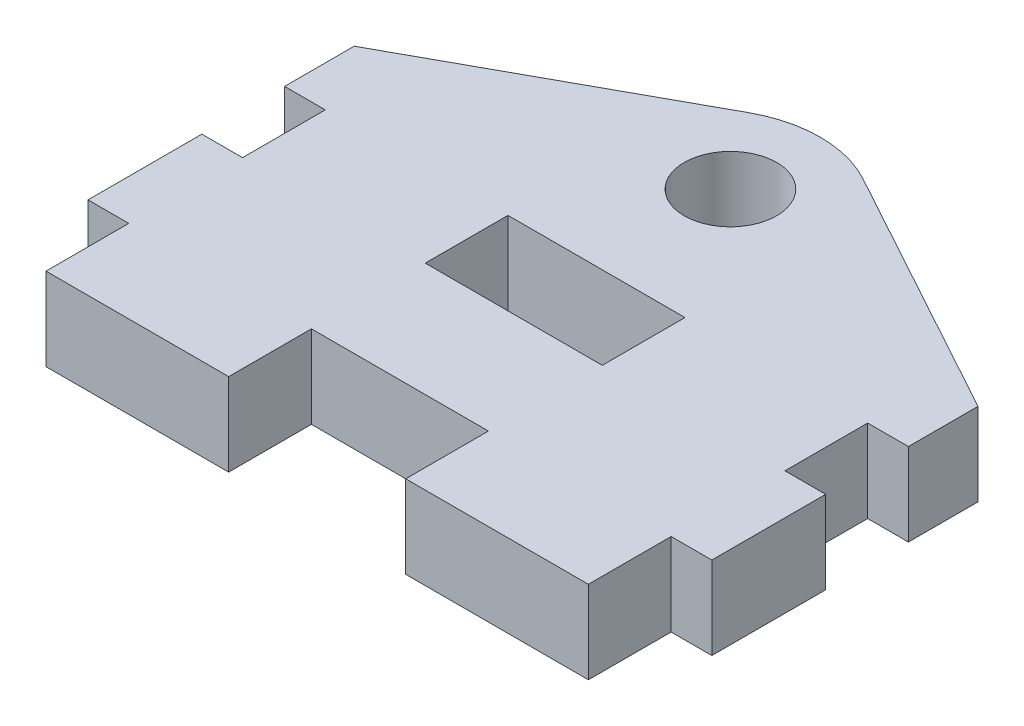
ISO-10303-21;
HEADER;
FILE_DESCRIPTION(('STEP AP214'),'2;1');
FILE_NAME('part.step','',(''),(''),'','','');
FILE_SCHEMA(('AUTOMOTIVE_DESIGN { 1 0 10303 214 1 1 1 1 }'));
ENDSEC;
DATA;
#1=APPLICATION_CONTEXT('core data for automotive mechanical design processes');
#2=APPLICATION_PROTOCOL_DEFINITION('international standard','automotive_design',2000,#1);
#3=PRODUCT_CONTEXT('',#1,'mechanical');
#4=PRODUCT('Part','Part','',(#3));
#5=PRODUCT_RELATED_PRODUCT_CATEGORY('part','',(#4));
#6=PRODUCT_DEFINITION_FORMATION('','',#4);
#7=PRODUCT_DEFINITION_CONTEXT('part definition',#1,'design');
#8=PRODUCT_DEFINITION('design','',#6,#7);
#9=PRODUCT_DEFINITION_SHAPE('','',#8);
#10=(LENGTH_UNIT() NAMED_UNIT(*) SI_UNIT(.MILLI.,.METRE.));
#11=(NAMED_UNIT(*) PLANE_ANGLE_UNIT() SI_UNIT($,.RADIAN.));
#12=(NAMED_UNIT(*) SI_UNIT($,.STERADIAN.) SOLID_ANGLE_UNIT());
#13=UNCERTAINTY_MEASURE_WITH_UNIT(LENGTH_MEASURE(1.E-05),#10,'distance_accuracy_value','');
#14=(GEOMETRIC_REPRESENTATION_CONTEXT(3) GLOBAL_UNCERTAINTY_ASSIGNED_CONTEXT((#13)) GLOBAL_UNIT_ASSIGNED_CONTEXT((#10,
#11,#12)) REPRESENTATION_CONTEXT('',''));
#15=CARTESIAN_POINT('',(0.,0.,0.));
#16=DIRECTION('',(0.,0.,1.));
#17=DIRECTION('',(1.,0.,0.));
#18=AXIS2_PLACEMENT_3D('',#15,#16,#17);
#19=CARTESIAN_POINT('',(-25.6,5.842,-21.2852032988051));
#20=DIRECTION('',(0.,-1.,0.));
#21=DIRECTION('',(0.,0.,-1.));
#22=AXIS2_PLACEMENT_3D('',#19,#20,#21);
#23=PLANE('',#22);
#24=CARTESIAN_POINT('',(-25.6,5.842,-23.3390276458498));
#25=DIRECTION('',(0.,1.,0.));
#26=DIRECTION('',(0.,0.,1.));
#27=AXIS2_PLACEMENT_3D('',#24,#25,#26);
#28=CIRCLE('',#27,3.26389999999999);
#29=CARTESIAN_POINT('',(-25.6,5.842,-20.0751276458499));
#30=VERTEX_POINT('',#29);
#31=EDGE_CURVE('E389',#30,#30,#28,.T.);
#32=ORIENTED_EDGE('',*,*,#31,.F.);
#33=EDGE_LOOP('',(#32));
#34=FACE_BOUND('',#33,.T.);
#35=DIRECTION('',(1.,0.,0.));
#36=VECTOR('',#35,1.);
#37=CARTESIAN_POINT('',(-0.400000000000005,5.842,-13.8795));
#38=LINE('',#37,#36);
#39=CARTESIAN_POINT('',(-6.45,5.842,-13.8795));
#40=VERTEX_POINT('',#39);
#41=CARTESIAN_POINT('',(-3.57499999999999,5.842,-13.8795));
#42=VERTEX_POINT('',#41);
#43=EDGE_CURVE('E221',#40,#42,#38,.T.);
#44=ORIENTED_EDGE('',*,*,#43,.T.);
#45=DIRECTION('',(0.,0.,1.));
#46=VECTOR('',#45,1.);
#47=CARTESIAN_POINT('',(-3.57499999999999,5.842,-13.7795));
#48=LINE('',#47,#46);
#49=CARTESIAN_POINT('',(-3.57499999999999,5.842,-18.7950088034694));
#50=VERTEX_POINT('',#49);
#51=EDGE_CURVE('E210',#50,#42,#48,.T.);
#52=ORIENTED_EDGE('',*,*,#51,.F.);
#53=DIRECTION('',(-0.876884617743927,0.,-0.480700912381168));
#54=VECTOR('',#53,1.);
#55=CARTESIAN_POINT('',(-0.400000000000005,5.842,-17.0545));
#56=LINE('',#55,#54);
#57=CARTESIAN_POINT('',(-21.5602739688845,5.842,-28.6543875989505));
#58=VERTEX_POINT('',#57);
#59=EDGE_CURVE('E218',#50,#58,#56,.T.);
#60=ORIENTED_EDGE('',*,*,#59,.T.);
#61=CARTESIAN_POINT('',(-25.6,5.842,-21.2852032988051));
#62=DIRECTION('',(0.,1.,0.));
#63=DIRECTION('',(0.,0.,-1.));
#64=AXIS2_PLACEMENT_3D('',#61,#62,#63);
#65=CIRCLE('',#64,8.40382434704476);
#66=CARTESIAN_POINT('',(-29.6397260311155,5.842,-28.6543875989505));
#67=VERTEX_POINT('',#66);
#68=EDGE_CURVE('E227',#58,#67,#65,.T.);
#69=ORIENTED_EDGE('',*,*,#68,.T.);
#70=DIRECTION('',(-0.876884617743927,0.,0.480700912381168));
#71=VECTOR('',#70,1.);
#72=CARTESIAN_POINT('',(-50.8,5.842,-17.0545));
#73=LINE('',#72,#71);
#74=CARTESIAN_POINT('',(-47.625,5.842,-18.7950088034694));
#75=VERTEX_POINT('',#74);
#76=EDGE_CURVE('E229',#67,#75,#73,.T.);
#77=ORIENTED_EDGE('',*,*,#76,.T.);
#78=DIRECTION('',(0.,0.,-1.));
#79=VECTOR('',#78,1.);
#80=CARTESIAN_POINT('',(-47.625,5.842,-13.8795));
#81=LINE('',#80,#79);
#82=CARTESIAN_POINT('',(-47.625,5.842,-13.8795));
#83=VERTEX_POINT('',#82);
#84=EDGE_CURVE('E359',#83,#75,#81,.T.);
#85=ORIENTED_EDGE('',*,*,#84,.F.);
#86=DIRECTION('',(1.,0.,0.));
#87=VECTOR('',#86,1.);
#88=CARTESIAN_POINT('',(-44.75,5.842,-13.8795));
#89=LINE('',#88,#87);
#90=CARTESIAN_POINT('',(-44.75,5.842,-13.8795));
#91=VERTEX_POINT('',#90);
#92=EDGE_CURVE('E237',#83,#91,#89,.T.);
#93=ORIENTED_EDGE('',*,*,#92,.T.);
#94=DIRECTION('',(0.,0.,1.));
#95=VECTOR('',#94,1.);
#96=CARTESIAN_POINT('',(-44.75,5.842,-8.03749999999998));
#97=LINE('',#96,#95);
#98=CARTESIAN_POINT('',(-44.75,5.842,-8.03749999999998));
#99=VERTEX_POINT('',#98);
#100=EDGE_CURVE('E239',#91,#99,#97,.T.);
#101=ORIENTED_EDGE('',*,*,#100,.T.);
#102=DIRECTION('',(-1.,0.,0.));
#103=VECTOR('',#102,1.);
#104=CARTESIAN_POINT('',(-44.75,5.842,-8.03749999999998));
#105=LINE('',#104,#103);
#106=CARTESIAN_POINT('',(-47.625,5.842,-8.03749999999999));
#107=VERTEX_POINT('',#106);
#108=EDGE_CURVE('E241',#99,#107,#105,.T.);
#109=ORIENTED_EDGE('',*,*,#108,.T.);
#110=DIRECTION('',(0.,0.,-1.));
#111=VECTOR('',#110,1.);
#112=CARTESIAN_POINT('',(-47.625,5.842,-8.03749999999999));
#113=LINE('',#112,#111);
#114=CARTESIAN_POINT('',(-47.625,5.842,0.));
#115=VERTEX_POINT('',#114);
#116=EDGE_CURVE('E380',#115,#107,#113,.T.);
#117=ORIENTED_EDGE('',*,*,#116,.F.);
#118=DIRECTION('',(1.,0.,0.));
#119=VECTOR('',#118,1.);
#120=CARTESIAN_POINT('',(-44.75,5.842,0.));
#121=LINE('',#120,#119);
#122=CARTESIAN_POINT('',(-44.75,5.842,0.));
#123=VERTEX_POINT('',#122);
#124=EDGE_CURVE('E244',#115,#123,#121,.T.);
#125=ORIENTED_EDGE('',*,*,#124,.T.);
#126=DIRECTION('',(0.,0.,1.));
#127=VECTOR('',#126,1.);
#128=CARTESIAN_POINT('',(-44.75,5.842,0.));
#129=LINE('',#128,#127);
#130=CARTESIAN_POINT('',(-44.75,5.842,5.842));
#131=VERTEX_POINT('',#130);
#132=EDGE_CURVE('E246',#123,#131,#129,.T.);
#133=ORIENTED_EDGE('',*,*,#132,.T.);
#134=DIRECTION('',(1.,0.,0.));
#135=VECTOR('',#134,1.);
#136=CARTESIAN_POINT('',(-44.75,5.842,5.842));
#137=LINE('',#136,#135);
#138=CARTESIAN_POINT('',(-31.85,5.842,5.842));
#139=VERTEX_POINT('',#138);
#140=EDGE_CURVE('E248',#131,#139,#137,.T.);
#141=ORIENTED_EDGE('',*,*,#140,.T.);
#142=DIRECTION('',(0.,0.,-1.));
#143=VECTOR('',#142,1.);
#144=CARTESIAN_POINT('',(-31.85,5.842,0.));
#145=LINE('',#144,#143);
#146=CARTESIAN_POINT('',(-31.85,5.842,0.));
#147=VERTEX_POINT('',#146);
#148=EDGE_CURVE('E250',#139,#147,#145,.T.);
#149=ORIENTED_EDGE('',*,*,#148,.T.);
#150=DIRECTION('',(1.,0.,0.));
#151=VECTOR('',#150,1.);
#152=CARTESIAN_POINT('',(-19.35,5.842,0.));
#153=LINE('',#152,#151);
#154=CARTESIAN_POINT('',(-19.35,5.842,0.));
#155=VERTEX_POINT('',#154);
#156=EDGE_CURVE('E252',#147,#155,#153,.T.);
#157=ORIENTED_EDGE('',*,*,#156,.T.);
#158=DIRECTION('',(0.,0.,1.));
#159=VECTOR('',#158,1.);
#160=CARTESIAN_POINT('',(-19.35,5.842,0.));
#161=LINE('',#160,#159);
#162=CARTESIAN_POINT('',(-19.35,5.842,5.842));
#163=VERTEX_POINT('',#162);
#164=EDGE_CURVE('E254',#155,#163,#161,.T.);
#165=ORIENTED_EDGE('',*,*,#164,.T.);
#166=DIRECTION('',(1.,0.,0.));
#167=VECTOR('',#166,1.);
#168=CARTESIAN_POINT('',(-6.45,5.842,5.842));
#169=LINE('',#168,#167);
#170=CARTESIAN_POINT('',(-6.45,5.842,5.842));
#171=VERTEX_POINT('',#170);
#172=EDGE_CURVE('E256',#163,#171,#169,.T.);
#173=ORIENTED_EDGE('',*,*,#172,.T.);
#174=DIRECTION('',(0.,0.,-1.));
#175=VECTOR('',#174,1.);
#176=CARTESIAN_POINT('',(-6.45,5.842,0.));
#177=LINE('',#176,#175);
#178=CARTESIAN_POINT('',(-6.45,5.842,0.));
#179=VERTEX_POINT('',#178);
#180=EDGE_CURVE('E258',#171,#179,#177,.T.);
#181=ORIENTED_EDGE('',*,*,#180,.T.);
#182=DIRECTION('',(1.,0.,0.));
#183=VECTOR('',#182,1.);
#184=CARTESIAN_POINT('',(0.,5.842,0.));
#185=LINE('',#184,#183);
#186=CARTESIAN_POINT('',(-3.57500000000001,5.842,0.));
#187=VERTEX_POINT('',#186);
#188=EDGE_CURVE('E260',#179,#187,#185,.T.);
#189=ORIENTED_EDGE('',*,*,#188,.T.);
#190=DIRECTION('',(0.,0.,1.));
#191=VECTOR('',#190,1.);
#192=CARTESIAN_POINT('',(-3.575,5.842,-9.49544559055014));
#193=LINE('',#192,#191);
#194=CARTESIAN_POINT('',(-3.575,5.842,-8.03749999999999));
#195=VERTEX_POINT('',#194);
#196=EDGE_CURVE('E370',#195,#187,#193,.T.);
#197=ORIENTED_EDGE('',*,*,#196,.F.);
#198=DIRECTION('',(-1.,0.,0.));
#199=VECTOR('',#198,1.);
#200=CARTESIAN_POINT('',(0.,5.842,-8.03749999999999));
#201=LINE('',#200,#199);
#202=CARTESIAN_POINT('',(-6.45,5.842,-8.03749999999999));
#203=VERTEX_POINT('',#202);
#204=EDGE_CURVE('E305',#195,#203,#201,.T.);
#205=ORIENTED_EDGE('',*,*,#204,.T.);
#206=DIRECTION('',(0.,0.,-1.));
#207=VECTOR('',#206,1.);
#208=CARTESIAN_POINT('',(-6.45,5.842,-8.03749999999999));
#209=LINE('',#208,#207);
#210=EDGE_CURVE('E231',#203,#40,#209,.T.);
#211=ORIENTED_EDGE('',*,*,#210,.T.);
#212=EDGE_LOOP('',(#44,#52,#60,#69,#77,#85,#93,#101,#109,#117,#125,#133,#141,#149,#157,#165,
#173,#181,#189,#197,#205,#211));
#213=FACE_BOUND('',#212,.T.);
#214=DIRECTION('',(0.,0.,-1.));
#215=VECTOR('',#214,1.);
#216=CARTESIAN_POINT('',(-19.35,5.842,-8.03749999999999));
#217=LINE('',#216,#215);
#218=CARTESIAN_POINT('',(-19.35,5.842,-8.03749999999999));
#219=VERTEX_POINT('',#218);
#220=CARTESIAN_POINT('',(-19.35,5.842,-13.8795));
#221=VERTEX_POINT('',#220);
#222=EDGE_CURVE('E397',#219,#221,#217,.T.);
#223=ORIENTED_EDGE('',*,*,#222,.F.);
#224=DIRECTION('',(1.,0.,0.));
#225=VECTOR('',#224,1.);
#226=CARTESIAN_POINT('',(-19.35,5.842,-8.03749999999999));
#227=LINE('',#226,#225);
#228=CARTESIAN_POINT('',(-31.85,5.842,-8.03749999999999));
#229=VERTEX_POINT('',#228);
#230=EDGE_CURVE('E405',#229,#219,#227,.T.);
#231=ORIENTED_EDGE('',*,*,#230,.F.);
#232=DIRECTION('',(0.,0.,1.));
#233=VECTOR('',#232,1.);
#234=CARTESIAN_POINT('',(-31.85,5.842,-8.03749999999999));
#235=LINE('',#234,#233);
#236=CARTESIAN_POINT('',(-31.85,5.842,-13.8795));
#237=VERTEX_POINT('',#236);
#238=EDGE_CURVE('E402',#237,#229,#235,.T.);
#239=ORIENTED_EDGE('',*,*,#238,.F.);
#240=DIRECTION('',(-1.,0.,0.));
#241=VECTOR('',#240,1.);
#242=CARTESIAN_POINT('',(-19.35,5.842,-13.8795));
#243=LINE('',#242,#241);
#244=EDGE_CURVE('E399',#221,#237,#243,.T.);
#245=ORIENTED_EDGE('',*,*,#244,.F.);
#246=EDGE_LOOP('',(#223,#231,#239,#245));
#247=FACE_BOUND('',#246,.T.);
#248=ADVANCED_FACE('F39',(#34,#213,#247),#23,.F.);
#249=CARTESIAN_POINT('',(-25.6,0.,-21.2852032988051));
#250=DIRECTION('',(0.,-1.,0.));
#251=DIRECTION('',(0.,0.,-1.));
#252=AXIS2_PLACEMENT_3D('',#249,#250,#251);
#253=PLANE('',#252);
#254=DIRECTION('',(0.,0.,1.));
#255=VECTOR('',#254,1.);
#256=CARTESIAN_POINT('',(-3.57499999999999,0.,-13.7795));
#257=LINE('',#256,#255);
#258=CARTESIAN_POINT('',(-3.575,0.,-18.7950088034694));
#259=VERTEX_POINT('',#258);
#260=CARTESIAN_POINT('',(-3.57499999999999,0.,-13.8795));
#261=VERTEX_POINT('',#260);
#262=EDGE_CURVE('E54',#259,#261,#257,.T.);
#263=ORIENTED_EDGE('',*,*,#262,.T.);
#264=DIRECTION('',(1.,0.,0.));
#265=VECTOR('',#264,1.);
#266=CARTESIAN_POINT('',(-0.400000000000005,0.,-13.8795));
#267=LINE('',#266,#265);
#268=CARTESIAN_POINT('',(-6.45,0.,-13.8795));
#269=VERTEX_POINT('',#268);
#270=EDGE_CURVE('E269',#269,#261,#267,.T.);
#271=ORIENTED_EDGE('',*,*,#270,.F.);
#272=DIRECTION('',(0.,0.,-1.));
#273=VECTOR('',#272,1.);
#274=CARTESIAN_POINT('',(-6.45,0.,-8.03749999999999));
#275=LINE('',#274,#273);
#276=CARTESIAN_POINT('',(-6.45,0.,-8.03749999999999));
#277=VERTEX_POINT('',#276);
#278=EDGE_CURVE('E266',#277,#269,#275,.T.);
#279=ORIENTED_EDGE('',*,*,#278,.F.);
#280=DIRECTION('',(-1.,0.,0.));
#281=VECTOR('',#280,1.);
#282=CARTESIAN_POINT('',(0.,0.,-8.03749999999999));
#283=LINE('',#282,#281);
#284=CARTESIAN_POINT('',(-3.575,0.,-8.03749999999999));
#285=VERTEX_POINT('',#284);
#286=EDGE_CURVE('E264',#285,#277,#283,.T.);
#287=ORIENTED_EDGE('',*,*,#286,.F.);
#288=DIRECTION('',(0.,0.,1.));
#289=VECTOR('',#288,1.);
#290=CARTESIAN_POINT('',(-3.575,0.,-9.49544559055014));
#291=LINE('',#290,#289);
#292=CARTESIAN_POINT('',(-3.57500000000001,0.,0.));
#293=VERTEX_POINT('',#292);
#294=EDGE_CURVE('E371',#285,#293,#291,.T.);
#295=ORIENTED_EDGE('',*,*,#294,.T.);
#296=DIRECTION('',(1.,0.,0.));
#297=VECTOR('',#296,1.);
#298=CARTESIAN_POINT('',(0.,0.,0.));
#299=LINE('',#298,#297);
#300=CARTESIAN_POINT('',(-6.45,0.,0.));
#301=VERTEX_POINT('',#300);
#302=EDGE_CURVE('E302',#301,#293,#299,.T.);
#303=ORIENTED_EDGE('',*,*,#302,.F.);
#304=DIRECTION('',(0.,0.,-1.));
#305=VECTOR('',#304,1.);
#306=CARTESIAN_POINT('',(-6.45,0.,0.));
#307=LINE('',#306,#305);
#308=CARTESIAN_POINT('',(-6.45,0.,5.842));
#309=VERTEX_POINT('',#308);
#310=EDGE_CURVE('E300',#309,#301,#307,.T.);
#311=ORIENTED_EDGE('',*,*,#310,.F.);
#312=DIRECTION('',(1.,0.,0.));
#313=VECTOR('',#312,1.);
#314=CARTESIAN_POINT('',(-6.45,0.,5.842));
#315=LINE('',#314,#313);
#316=CARTESIAN_POINT('',(-19.35,0.,5.842));
#317=VERTEX_POINT('',#316);
#318=EDGE_CURVE('E298',#317,#309,#315,.T.);
#319=ORIENTED_EDGE('',*,*,#318,.F.);
#320=DIRECTION('',(0.,0.,1.));
#321=VECTOR('',#320,1.);
#322=CARTESIAN_POINT('',(-19.35,0.,0.));
#323=LINE('',#322,#321);
#324=CARTESIAN_POINT('',(-19.35,0.,0.));
#325=VERTEX_POINT('',#324);
#326=EDGE_CURVE('E296',#325,#317,#323,.T.);
#327=ORIENTED_EDGE('',*,*,#326,.F.);
#328=DIRECTION('',(1.,0.,0.));
#329=VECTOR('',#328,1.);
#330=CARTESIAN_POINT('',(-19.35,0.,0.));
#331=LINE('',#330,#329);
#332=CARTESIAN_POINT('',(-31.85,0.,0.));
#333=VERTEX_POINT('',#332);
#334=EDGE_CURVE('E294',#333,#325,#331,.T.);
#335=ORIENTED_EDGE('',*,*,#334,.F.);
#336=DIRECTION('',(0.,0.,-1.));
#337=VECTOR('',#336,1.);
#338=CARTESIAN_POINT('',(-31.85,0.,0.));
#339=LINE('',#338,#337);
#340=CARTESIAN_POINT('',(-31.85,0.,5.842));
#341=VERTEX_POINT('',#340);
#342=EDGE_CURVE('E292',#341,#333,#339,.T.);
#343=ORIENTED_EDGE('',*,*,#342,.F.);
#344=DIRECTION('',(1.,0.,0.));
#345=VECTOR('',#344,1.);
#346=CARTESIAN_POINT('',(-44.75,0.,5.842));
#347=LINE('',#346,#345);
#348=CARTESIAN_POINT('',(-44.75,0.,5.842));
#349=VERTEX_POINT('',#348);
#350=EDGE_CURVE('E290',#349,#341,#347,.T.);
#351=ORIENTED_EDGE('',*,*,#350,.F.);
#352=DIRECTION('',(0.,0.,1.));
#353=VECTOR('',#352,1.);
#354=CARTESIAN_POINT('',(-44.75,0.,0.));
#355=LINE('',#354,#353);
#356=CARTESIAN_POINT('',(-44.75,0.,0.));
#357=VERTEX_POINT('',#356);
#358=EDGE_CURVE('E288',#357,#349,#355,.T.);
#359=ORIENTED_EDGE('',*,*,#358,.F.);
#360=DIRECTION('',(1.,0.,0.));
#361=VECTOR('',#360,1.);
#362=CARTESIAN_POINT('',(-44.75,0.,0.));
#363=LINE('',#362,#361);
#364=CARTESIAN_POINT('',(-47.625,0.,0.));
#365=VERTEX_POINT('',#364);
#366=EDGE_CURVE('E286',#365,#357,#363,.T.);
#367=ORIENTED_EDGE('',*,*,#366,.F.);
#368=DIRECTION('',(0.,0.,-1.));
#369=VECTOR('',#368,1.);
#370=CARTESIAN_POINT('',(-47.625,0.,-8.03749999999999));
#371=LINE('',#370,#369);
#372=CARTESIAN_POINT('',(-47.625,0.,-8.03749999999999));
#373=VERTEX_POINT('',#372);
#374=EDGE_CURVE('E381',#365,#373,#371,.T.);
#375=ORIENTED_EDGE('',*,*,#374,.T.);
#376=DIRECTION('',(-1.,0.,0.));
#377=VECTOR('',#376,1.);
#378=CARTESIAN_POINT('',(-44.75,0.,-8.03749999999998));
#379=LINE('',#378,#377);
#380=CARTESIAN_POINT('',(-44.75,0.,-8.03749999999998));
#381=VERTEX_POINT('',#380);
#382=EDGE_CURVE('E283',#381,#373,#379,.T.);
#383=ORIENTED_EDGE('',*,*,#382,.F.);
#384=DIRECTION('',(0.,0.,1.));
#385=VECTOR('',#384,1.);
#386=CARTESIAN_POINT('',(-44.75,0.,-8.03749999999998));
#387=LINE('',#386,#385);
#388=CARTESIAN_POINT('',(-44.75,0.,-13.8795));
#389=VERTEX_POINT('',#388);
#390=EDGE_CURVE('E281',#389,#381,#387,.T.);
#391=ORIENTED_EDGE('',*,*,#390,.F.);
#392=DIRECTION('',(1.,0.,0.));
#393=VECTOR('',#392,1.);
#394=CARTESIAN_POINT('',(-44.75,0.,-13.8795));
#395=LINE('',#394,#393);
#396=CARTESIAN_POINT('',(-47.625,0.,-13.8795));
#397=VERTEX_POINT('',#396);
#398=EDGE_CURVE('E279',#397,#389,#395,.T.);
#399=ORIENTED_EDGE('',*,*,#398,.F.);
#400=DIRECTION('',(0.,0.,-1.));
#401=VECTOR('',#400,1.);
#402=CARTESIAN_POINT('',(-47.625,0.,-13.8795));
#403=LINE('',#402,#401);
#404=CARTESIAN_POINT('',(-47.625,0.,-18.7950088034694));
#405=VERTEX_POINT('',#404);
#406=EDGE_CURVE('E61',#397,#405,#403,.T.);
#407=ORIENTED_EDGE('',*,*,#406,.T.);
#408=DIRECTION('',(-0.876884617743927,0.,0.480700912381168));
#409=VECTOR('',#408,1.);
#410=CARTESIAN_POINT('',(-50.8,0.,-17.0545));
#411=LINE('',#410,#409);
#412=CARTESIAN_POINT('',(-29.6397260311155,0.,-28.6543875989505));
#413=VERTEX_POINT('',#412);
#414=EDGE_CURVE('E276',#413,#405,#411,.T.);
#415=ORIENTED_EDGE('',*,*,#414,.F.);
#416=CARTESIAN_POINT('',(-25.6,0.,-21.2852032988051));
#417=DIRECTION('',(0.,1.,0.));
#418=DIRECTION('',(0.,0.,-1.));
#419=AXIS2_PLACEMENT_3D('',#416,#417,#418);
#420=CIRCLE('',#419,8.40382434704476);
#421=CARTESIAN_POINT('',(-21.5602739688845,0.,-28.6543875989505));
#422=VERTEX_POINT('',#421);
#423=EDGE_CURVE('E274',#422,#413,#420,.T.);
#424=ORIENTED_EDGE('',*,*,#423,.F.);
#425=DIRECTION('',(-0.876884617743927,0.,-0.480700912381168));
#426=VECTOR('',#425,1.);
#427=CARTESIAN_POINT('',(-0.400000000000005,0.,-17.0545));
#428=LINE('',#427,#426);
#429=EDGE_CURVE('E272',#259,#422,#428,.T.);
#430=ORIENTED_EDGE('',*,*,#429,.F.);
#431=EDGE_LOOP('',(#263,#271,#279,#287,#295,#303,#311,#319,#327,#335,#343,#351,#359,#367,#375,
#383,#391,#399,#407,#415,#424,#430));
#432=FACE_BOUND('',#431,.T.);
#433=CARTESIAN_POINT('',(-25.6,0.,-23.3390276458498));
#434=DIRECTION('',(0.,1.,0.));
#435=DIRECTION('',(0.,0.,1.));
#436=AXIS2_PLACEMENT_3D('',#433,#434,#435);
#437=CIRCLE('',#436,3.2639);
#438=CARTESIAN_POINT('',(-25.6,0.,-20.0751276458498));
#439=VERTEX_POINT('',#438);
#440=EDGE_CURVE('E393',#439,#439,#437,.T.);
#441=ORIENTED_EDGE('',*,*,#440,.T.);
#442=EDGE_LOOP('',(#441));
#443=FACE_BOUND('',#442,.T.);
#444=DIRECTION('',(1.,0.,0.));
#445=VECTOR('',#444,1.);
#446=CARTESIAN_POINT('',(-19.35,0.,-8.03749999999999));
#447=LINE('',#446,#445);
#448=CARTESIAN_POINT('',(-31.85,0.,-8.03749999999999));
#449=VERTEX_POINT('',#448);
#450=CARTESIAN_POINT('',(-19.35,0.,-8.03749999999999));
#451=VERTEX_POINT('',#450);
#452=EDGE_CURVE('E400',#449,#451,#447,.T.);
#453=ORIENTED_EDGE('',*,*,#452,.T.);
#454=DIRECTION('',(0.,0.,-1.));
#455=VECTOR('',#454,1.);
#456=CARTESIAN_POINT('',(-19.35,0.,-8.03749999999999));
#457=LINE('',#456,#455);
#458=CARTESIAN_POINT('',(-19.35,0.,-13.8795));
#459=VERTEX_POINT('',#458);
#460=EDGE_CURVE('E396',#451,#459,#457,.T.);
#461=ORIENTED_EDGE('',*,*,#460,.T.);
#462=DIRECTION('',(-1.,0.,0.));
#463=VECTOR('',#462,1.);
#464=CARTESIAN_POINT('',(-19.35,0.,-13.8795));
#465=LINE('',#464,#463);
#466=CARTESIAN_POINT('',(-31.85,0.,-13.8795));
#467=VERTEX_POINT('',#466);
#468=EDGE_CURVE('E410',#459,#467,#465,.T.);
#469=ORIENTED_EDGE('',*,*,#468,.T.);
#470=DIRECTION('',(0.,0.,1.));
#471=VECTOR('',#470,1.);
#472=CARTESIAN_POINT('',(-31.85,0.,-8.03749999999999));
#473=LINE('',#472,#471);
#474=EDGE_CURVE('E413',#467,#449,#473,.T.);
#475=ORIENTED_EDGE('',*,*,#474,.T.);
#476=EDGE_LOOP('',(#453,#461,#469,#475));
#477=FACE_BOUND('',#476,.T.);
#478=ADVANCED_FACE('F353',(#432,#443,#477),#253,.T.);
#479=CARTESIAN_POINT('',(0.,5.842,-8.03749999999999));
#480=DIRECTION('',(0.,0.,1.));
#481=DIRECTION('',(1.,0.,0.));
#482=AXIS2_PLACEMENT_3D('',#479,#480,#481);
#483=PLANE('',#482);
#484=ORIENTED_EDGE('',*,*,#204,.F.);
#485=DIRECTION('',(0.,-1.,0.));
#486=VECTOR('',#485,1.);
#487=CARTESIAN_POINT('',(-3.575,5.842,-8.03749999999999));
#488=LINE('',#487,#486);
#489=EDGE_CURVE('E377',#195,#285,#488,.T.);
#490=ORIENTED_EDGE('',*,*,#489,.T.);
#491=ORIENTED_EDGE('',*,*,#286,.T.);
#492=DIRECTION('',(0.,-1.,0.));
#493=VECTOR('',#492,1.);
#494=CARTESIAN_POINT('',(-6.45,5.842,-8.03749999999999));
#495=LINE('',#494,#493);
#496=EDGE_CURVE('E47',#203,#277,#495,.T.);
#497=ORIENTED_EDGE('',*,*,#496,.F.);
#498=EDGE_LOOP('',(#484,#490,#491,#497));
#499=FACE_BOUND('',#498,.T.);
#500=ADVANCED_FACE('F41',(#499),#483,.F.);
#501=CARTESIAN_POINT('',(-6.45,5.842,-8.03749999999999));
#502=DIRECTION('',(-1.,0.,0.));
#503=DIRECTION('',(0.,0.,1.));
#504=AXIS2_PLACEMENT_3D('',#501,#502,#503);
#505=PLANE('',#504);
#506=ORIENTED_EDGE('',*,*,#278,.T.);
#507=DIRECTION('',(0.,-1.,0.));
#508=VECTOR('',#507,1.);
#509=CARTESIAN_POINT('',(-6.45,5.842,-13.8795));
#510=LINE('',#509,#508);
#511=EDGE_CURVE('E339',#40,#269,#510,.T.);
#512=ORIENTED_EDGE('',*,*,#511,.F.);
#513=ORIENTED_EDGE('',*,*,#210,.F.);
#514=ORIENTED_EDGE('',*,*,#496,.T.);
#515=EDGE_LOOP('',(#506,#512,#513,#514));
#516=FACE_BOUND('',#515,.T.);
#517=ADVANCED_FACE('F346',(#516),#505,.F.);
#518=CARTESIAN_POINT('',(-0.400000000000005,5.842,-13.8795));
#519=DIRECTION('',(0.,0.,-1.));
#520=DIRECTION('',(-1.,0.,0.));
#521=AXIS2_PLACEMENT_3D('',#518,#519,#520);
#522=PLANE('',#521);
#523=ORIENTED_EDGE('',*,*,#270,.T.);
#524=DIRECTION('',(0.,1.,0.));
#525=VECTOR('',#524,1.);
#526=CARTESIAN_POINT('',(-3.57499999999999,5.842,-13.8795));
#527=LINE('',#526,#525);
#528=EDGE_CURVE('E358',#261,#42,#527,.T.);
#529=ORIENTED_EDGE('',*,*,#528,.T.);
#530=ORIENTED_EDGE('',*,*,#43,.F.);
#531=ORIENTED_EDGE('',*,*,#511,.T.);
#532=EDGE_LOOP('',(#523,#529,#530,#531));
#533=FACE_BOUND('',#532,.T.);
#534=ADVANCED_FACE('F357',(#533),#522,.F.);
#535=CARTESIAN_POINT('',(-0.400000000000005,5.842,-17.0545));
#536=DIRECTION('',(-0.480700912381168,0.,0.876884617743927));
#537=DIRECTION('',(0.876884617743927,0.,0.480700912381168));
#538=AXIS2_PLACEMENT_3D('',#535,#536,#537);
#539=PLANE('',#538);
#540=ORIENTED_EDGE('',*,*,#59,.F.);
#541=DIRECTION('',(0.,-1.,0.));
#542=VECTOR('',#541,1.);
#543=CARTESIAN_POINT('',(-3.57499999999999,5.842,-18.7950088034694));
#544=LINE('',#543,#542);
#545=EDGE_CURVE('E11',#50,#259,#544,.T.);
#546=ORIENTED_EDGE('',*,*,#545,.T.);
#547=ORIENTED_EDGE('',*,*,#429,.T.);
#548=DIRECTION('',(0.,-1.,0.));
#549=VECTOR('',#548,1.);
#550=CARTESIAN_POINT('',(-21.5602739688845,5.842,-28.6543875989505));
#551=LINE('',#550,#549);
#552=EDGE_CURVE('E225',#58,#422,#551,.T.);
#553=ORIENTED_EDGE('',*,*,#552,.F.);
#554=EDGE_LOOP('',(#540,#546,#547,#553));
#555=FACE_BOUND('',#554,.T.);
#556=ADVANCED_FACE('F223',(#555),#539,.F.);
#557=CARTESIAN_POINT('',(-25.6,5.842,-21.2852032988051));
#558=DIRECTION('',(0.,-1.,0.));
#559=DIRECTION('',(0.,0.,-1.));
#560=AXIS2_PLACEMENT_3D('',#557,#558,#559);
#561=CYLINDRICAL_SURFACE('',#560,8.40382434704476);
#562=ORIENTED_EDGE('',*,*,#423,.T.);
#563=DIRECTION('',(0.,-1.,0.));
#564=VECTOR('',#563,1.);
#565=CARTESIAN_POINT('',(-29.6397260311155,5.842,-28.6543875989505));
#566=LINE('',#565,#564);
#567=EDGE_CURVE('E335',#67,#413,#566,.T.);
#568=ORIENTED_EDGE('',*,*,#567,.F.);
#569=ORIENTED_EDGE('',*,*,#68,.F.);
#570=ORIENTED_EDGE('',*,*,#552,.T.);
#571=EDGE_LOOP('',(#562,#568,#569,#570));
#572=FACE_BOUND('',#571,.T.);
#573=ADVANCED_FACE('F500',(#572),#561,.T.);
#574=CARTESIAN_POINT('',(-50.8,5.842,-17.0545));
#575=DIRECTION('',(0.480700912381168,0.,0.876884617743927));
#576=DIRECTION('',(0.876884617743927,0.,-0.480700912381168));
#577=AXIS2_PLACEMENT_3D('',#574,#575,#576);
#578=PLANE('',#577);
#579=ORIENTED_EDGE('',*,*,#414,.T.);
#580=DIRECTION('',(0.,1.,0.));
#581=VECTOR('',#580,1.);
#582=CARTESIAN_POINT('',(-47.625,5.842,-18.7950088034694));
#583=LINE('',#582,#581);
#584=EDGE_CURVE('E367',#405,#75,#583,.T.);
#585=ORIENTED_EDGE('',*,*,#584,.T.);
#586=ORIENTED_EDGE('',*,*,#76,.F.);
#587=ORIENTED_EDGE('',*,*,#567,.T.);
#588=EDGE_LOOP('',(#579,#585,#586,#587));
#589=FACE_BOUND('',#588,.T.);
#590=ADVANCED_FACE('F496',(#589),#578,.F.);
#591=CARTESIAN_POINT('',(-44.75,5.842,-13.8795));
#592=DIRECTION('',(0.,0.,-1.));
#593=DIRECTION('',(-1.,0.,0.));
#594=AXIS2_PLACEMENT_3D('',#591,#592,#593);
#595=PLANE('',#594);
#596=ORIENTED_EDGE('',*,*,#92,.F.);
#597=DIRECTION('',(0.,1.,0.));
#598=VECTOR('',#597,1.);
#599=CARTESIAN_POINT('',(-47.625,0.,-13.8795));
#600=LINE('',#599,#598);
#601=EDGE_CURVE('E364',#397,#83,#600,.T.);
#602=ORIENTED_EDGE('',*,*,#601,.F.);
#603=ORIENTED_EDGE('',*,*,#398,.T.);
#604=DIRECTION('',(0.,-1.,0.));
#605=VECTOR('',#604,1.);
#606=CARTESIAN_POINT('',(-44.75,5.842,-13.8795));
#607=LINE('',#606,#605);
#608=EDGE_CURVE('E332',#91,#389,#607,.T.);
#609=ORIENTED_EDGE('',*,*,#608,.F.);
#610=EDGE_LOOP('',(#596,#602,#603,#609));
#611=FACE_BOUND('',#610,.T.);
#612=ADVANCED_FACE('F490',(#611),#595,.F.);
#613=CARTESIAN_POINT('',(-44.75,5.842,-8.03749999999998));
#614=DIRECTION('',(1.,0.,0.));
#615=DIRECTION('',(0.,0.,-1.));
#616=AXIS2_PLACEMENT_3D('',#613,#614,#615);
#617=PLANE('',#616);
#618=ORIENTED_EDGE('',*,*,#390,.T.);
#619=DIRECTION('',(0.,-1.,0.));
#620=VECTOR('',#619,1.);
#621=CARTESIAN_POINT('',(-44.75,5.842,-8.03749999999998));
#622=LINE('',#621,#620);
#623=EDGE_CURVE('E329',#99,#381,#622,.T.);
#624=ORIENTED_EDGE('',*,*,#623,.F.);
#625=ORIENTED_EDGE('',*,*,#100,.F.);
#626=ORIENTED_EDGE('',*,*,#608,.T.);
#627=EDGE_LOOP('',(#618,#624,#625,#626));
#628=FACE_BOUND('',#627,.T.);
#629=ADVANCED_FACE('F486',(#628),#617,.F.);
#630=CARTESIAN_POINT('',(-44.75,5.842,-8.03749999999998));
#631=DIRECTION('',(0.,0.,1.));
#632=DIRECTION('',(1.,0.,0.));
#633=AXIS2_PLACEMENT_3D('',#630,#631,#632);
#634=PLANE('',#633);
#635=ORIENTED_EDGE('',*,*,#382,.T.);
#636=DIRECTION('',(0.,1.,0.));
#637=VECTOR('',#636,1.);
#638=CARTESIAN_POINT('',(-47.625,0.,-8.03749999999999));
#639=LINE('',#638,#637);
#640=EDGE_CURVE('E386',#373,#107,#639,.T.);
#641=ORIENTED_EDGE('',*,*,#640,.T.);
#642=ORIENTED_EDGE('',*,*,#108,.F.);
#643=ORIENTED_EDGE('',*,*,#623,.T.);
#644=EDGE_LOOP('',(#635,#641,#642,#643));
#645=FACE_BOUND('',#644,.T.);
#646=ADVANCED_FACE('F482',(#645),#634,.F.);
#647=CARTESIAN_POINT('',(-44.75,5.842,0.));
#648=DIRECTION('',(0.,0.,-1.));
#649=DIRECTION('',(-1.,0.,0.));
#650=AXIS2_PLACEMENT_3D('',#647,#648,#649);
#651=PLANE('',#650);
#652=ORIENTED_EDGE('',*,*,#124,.F.);
#653=DIRECTION('',(0.,1.,0.));
#654=VECTOR('',#653,1.);
#655=CARTESIAN_POINT('',(-47.625,0.,0.));
#656=LINE('',#655,#654);
#657=EDGE_CURVE('E384',#365,#115,#656,.T.);
#658=ORIENTED_EDGE('',*,*,#657,.F.);
#659=ORIENTED_EDGE('',*,*,#366,.T.);
#660=DIRECTION('',(0.,-1.,0.));
#661=VECTOR('',#660,1.);
#662=CARTESIAN_POINT('',(-44.75,5.842,0.));
#663=LINE('',#662,#661);
#664=EDGE_CURVE('E326',#123,#357,#663,.T.);
#665=ORIENTED_EDGE('',*,*,#664,.F.);
#666=EDGE_LOOP('',(#652,#658,#659,#665));
#667=FACE_BOUND('',#666,.T.);
#668=ADVANCED_FACE('F474',(#667),#651,.F.);
#669=CARTESIAN_POINT('',(-44.75,5.842,0.));
#670=DIRECTION('',(1.,0.,0.));
#671=DIRECTION('',(0.,0.,-1.));
#672=AXIS2_PLACEMENT_3D('',#669,#670,#671);
#673=PLANE('',#672);
#674=ORIENTED_EDGE('',*,*,#358,.T.);
#675=DIRECTION('',(0.,-1.,0.));
#676=VECTOR('',#675,1.);
#677=CARTESIAN_POINT('',(-44.75,5.842,5.842));
#678=LINE('',#677,#676);
#679=EDGE_CURVE('E323',#131,#349,#678,.T.);
#680=ORIENTED_EDGE('',*,*,#679,.F.);
#681=ORIENTED_EDGE('',*,*,#132,.F.);
#682=ORIENTED_EDGE('',*,*,#664,.T.);
#683=EDGE_LOOP('',(#674,#680,#681,#682));
#684=FACE_BOUND('',#683,.T.);
#685=ADVANCED_FACE('F467',(#684),#673,.F.);
#686=CARTESIAN_POINT('',(-44.75,5.842,5.842));
#687=DIRECTION('',(0.,0.,-1.));
#688=DIRECTION('',(-1.,0.,0.));
#689=AXIS2_PLACEMENT_3D('',#686,#687,#688);
#690=PLANE('',#689);
#691=ORIENTED_EDGE('',*,*,#350,.T.);
#692=DIRECTION('',(0.,-1.,0.));
#693=VECTOR('',#692,1.);
#694=CARTESIAN_POINT('',(-31.85,5.842,5.842));
#695=LINE('',#694,#693);
#696=EDGE_CURVE('E320',#139,#341,#695,.T.);
#697=ORIENTED_EDGE('',*,*,#696,.F.);
#698=ORIENTED_EDGE('',*,*,#140,.F.);
#699=ORIENTED_EDGE('',*,*,#679,.T.);
#700=EDGE_LOOP('',(#691,#697,#698,#699));
#701=FACE_BOUND('',#700,.T.);
#702=ADVANCED_FACE('F463',(#701),#690,.F.);
#703=CARTESIAN_POINT('',(-31.85,5.842,0.));
#704=DIRECTION('',(-1.,0.,0.));
#705=DIRECTION('',(0.,0.,1.));
#706=AXIS2_PLACEMENT_3D('',#703,#704,#705);
#707=PLANE('',#706);
#708=ORIENTED_EDGE('',*,*,#342,.T.);
#709=DIRECTION('',(0.,-1.,0.));
#710=VECTOR('',#709,1.);
#711=CARTESIAN_POINT('',(-31.85,5.842,0.));
#712=LINE('',#711,#710);
#713=EDGE_CURVE('E317',#147,#333,#712,.T.);
#714=ORIENTED_EDGE('',*,*,#713,.F.);
#715=ORIENTED_EDGE('',*,*,#148,.F.);
#716=ORIENTED_EDGE('',*,*,#696,.T.);
#717=EDGE_LOOP('',(#708,#714,#715,#716));
#718=FACE_BOUND('',#717,.T.);
#719=ADVANCED_FACE('F458',(#718),#707,.F.);
#720=CARTESIAN_POINT('',(-19.35,5.842,0.));
#721=DIRECTION('',(0.,0.,-1.));
#722=DIRECTION('',(-1.,0.,0.));
#723=AXIS2_PLACEMENT_3D('',#720,#721,#722);
#724=PLANE('',#723);
#725=ORIENTED_EDGE('',*,*,#334,.T.);
#726=DIRECTION('',(0.,-1.,0.));
#727=VECTOR('',#726,1.);
#728=CARTESIAN_POINT('',(-19.35,5.842,0.));
#729=LINE('',#728,#727);
#730=EDGE_CURVE('E314',#155,#325,#729,.T.);
#731=ORIENTED_EDGE('',*,*,#730,.F.);
#732=ORIENTED_EDGE('',*,*,#156,.F.);
#733=ORIENTED_EDGE('',*,*,#713,.T.);
#734=EDGE_LOOP('',(#725,#731,#732,#733));
#735=FACE_BOUND('',#734,.T.);
#736=ADVANCED_FACE('F452',(#735),#724,.F.);
#737=CARTESIAN_POINT('',(-19.35,5.842,0.));
#738=DIRECTION('',(1.,0.,0.));
#739=DIRECTION('',(0.,0.,-1.));
#740=AXIS2_PLACEMENT_3D('',#737,#738,#739);
#741=PLANE('',#740);
#742=ORIENTED_EDGE('',*,*,#326,.T.);
#743=DIRECTION('',(0.,-1.,0.));
#744=VECTOR('',#743,1.);
#745=CARTESIAN_POINT('',(-19.35,5.842,5.842));
#746=LINE('',#745,#744);
#747=EDGE_CURVE('E311',#163,#317,#746,.T.);
#748=ORIENTED_EDGE('',*,*,#747,.F.);
#749=ORIENTED_EDGE('',*,*,#164,.F.);
#750=ORIENTED_EDGE('',*,*,#730,.T.);
#751=EDGE_LOOP('',(#742,#748,#749,#750));
#752=FACE_BOUND('',#751,.T.);
#753=ADVANCED_FACE('F448',(#752),#741,.F.);
#754=CARTESIAN_POINT('',(-6.45,5.842,5.842));
#755=DIRECTION('',(0.,0.,-1.));
#756=DIRECTION('',(-1.,0.,0.));
#757=AXIS2_PLACEMENT_3D('',#754,#755,#756);
#758=PLANE('',#757);
#759=ORIENTED_EDGE('',*,*,#318,.T.);
#760=DIRECTION('',(0.,-1.,0.));
#761=VECTOR('',#760,1.);
#762=CARTESIAN_POINT('',(-6.45,5.842,5.842));
#763=LINE('',#762,#761);
#764=EDGE_CURVE('E308',#171,#309,#763,.T.);
#765=ORIENTED_EDGE('',*,*,#764,.F.);
#766=ORIENTED_EDGE('',*,*,#172,.F.);
#767=ORIENTED_EDGE('',*,*,#747,.T.);
#768=EDGE_LOOP('',(#759,#765,#766,#767));
#769=FACE_BOUND('',#768,.T.);
#770=ADVANCED_FACE('F443',(#769),#758,.F.);
#771=CARTESIAN_POINT('',(-6.45,5.842,0.));
#772=DIRECTION('',(-1.,0.,0.));
#773=DIRECTION('',(0.,0.,1.));
#774=AXIS2_PLACEMENT_3D('',#771,#772,#773);
#775=PLANE('',#774);
#776=ORIENTED_EDGE('',*,*,#310,.T.);
#777=DIRECTION('',(0.,-1.,0.));
#778=VECTOR('',#777,1.);
#779=CARTESIAN_POINT('',(-6.45,5.842,0.));
#780=LINE('',#779,#778);
#781=EDGE_CURVE('E263',#179,#301,#780,.T.);
#782=ORIENTED_EDGE('',*,*,#781,.F.);
#783=ORIENTED_EDGE('',*,*,#180,.F.);
#784=ORIENTED_EDGE('',*,*,#764,.T.);
#785=EDGE_LOOP('',(#776,#782,#783,#784));
#786=FACE_BOUND('',#785,.T.);
#787=ADVANCED_FACE('F437',(#786),#775,.F.);
#788=CARTESIAN_POINT('',(0.,5.842,0.));
#789=DIRECTION('',(0.,0.,-1.));
#790=DIRECTION('',(-1.,0.,0.));
#791=AXIS2_PLACEMENT_3D('',#788,#789,#790);
#792=PLANE('',#791);
#793=ORIENTED_EDGE('',*,*,#302,.T.);
#794=DIRECTION('',(0.,1.,0.));
#795=VECTOR('',#794,1.);
#796=CARTESIAN_POINT('',(-3.57500000000001,0.,0.));
#797=LINE('',#796,#795);
#798=EDGE_CURVE('E373',#293,#187,#797,.T.);
#799=ORIENTED_EDGE('',*,*,#798,.T.);
#800=ORIENTED_EDGE('',*,*,#188,.F.);
#801=ORIENTED_EDGE('',*,*,#781,.T.);
#802=EDGE_LOOP('',(#793,#799,#800,#801));
#803=FACE_BOUND('',#802,.T.);
#804=ADVANCED_FACE('F432',(#803),#792,.F.);
#805=CARTESIAN_POINT('',(-19.35,5.842,-8.03749999999999));
#806=DIRECTION('',(-1.,0.,0.));
#807=DIRECTION('',(0.,0.,1.));
#808=AXIS2_PLACEMENT_3D('',#805,#806,#807);
#809=PLANE('',#808);
#810=ORIENTED_EDGE('',*,*,#460,.F.);
#811=DIRECTION('',(0.,-1.,0.));
#812=VECTOR('',#811,1.);
#813=CARTESIAN_POINT('',(-19.35,5.842,-8.03749999999999));
#814=LINE('',#813,#812);
#815=EDGE_CURVE('E407',#219,#451,#814,.T.);
#816=ORIENTED_EDGE('',*,*,#815,.F.);
#817=ORIENTED_EDGE('',*,*,#222,.T.);
#818=DIRECTION('',(0.,-1.,0.));
#819=VECTOR('',#818,1.);
#820=CARTESIAN_POINT('',(-19.35,5.842,-13.8795));
#821=LINE('',#820,#819);
#822=EDGE_CURVE('E267',#221,#459,#821,.T.);
#823=ORIENTED_EDGE('',*,*,#822,.T.);
#824=EDGE_LOOP('',(#810,#816,#817,#823));
#825=FACE_BOUND('',#824,.T.);
#826=ADVANCED_FACE('F518',(#825),#809,.T.);
#827=CARTESIAN_POINT('',(-19.35,5.842,-13.8795));
#828=DIRECTION('',(0.,0.,1.));
#829=DIRECTION('',(1.,0.,0.));
#830=AXIS2_PLACEMENT_3D('',#827,#828,#829);
#831=PLANE('',#830);
#832=ORIENTED_EDGE('',*,*,#468,.F.);
#833=ORIENTED_EDGE('',*,*,#822,.F.);
#834=ORIENTED_EDGE('',*,*,#244,.T.);
#835=DIRECTION('',(0.,-1.,0.));
#836=VECTOR('',#835,1.);
#837=CARTESIAN_POINT('',(-31.85,5.842,-13.8795));
#838=LINE('',#837,#836);
#839=EDGE_CURVE('E422',#237,#467,#838,.T.);
#840=ORIENTED_EDGE('',*,*,#839,.T.);
#841=EDGE_LOOP('',(#832,#833,#834,#840));
#842=FACE_BOUND('',#841,.T.);
#843=ADVANCED_FACE('F602',(#842),#831,.T.);
#844=CARTESIAN_POINT('',(-31.85,5.842,-8.03749999999999));
#845=DIRECTION('',(1.,0.,0.));
#846=DIRECTION('',(0.,0.,-1.));
#847=AXIS2_PLACEMENT_3D('',#844,#845,#846);
#848=PLANE('',#847);
#849=ORIENTED_EDGE('',*,*,#474,.F.);
#850=ORIENTED_EDGE('',*,*,#839,.F.);
#851=ORIENTED_EDGE('',*,*,#238,.T.);
#852=DIRECTION('',(0.,-1.,0.));
#853=VECTOR('',#852,1.);
#854=CARTESIAN_POINT('',(-31.85,5.842,-8.03749999999999));
#855=LINE('',#854,#853);
#856=EDGE_CURVE('E420',#229,#449,#855,.T.);
#857=ORIENTED_EDGE('',*,*,#856,.T.);
#858=EDGE_LOOP('',(#849,#850,#851,#857));
#859=FACE_BOUND('',#858,.T.);
#860=ADVANCED_FACE('F609',(#859),#848,.T.);
#861=CARTESIAN_POINT('',(-19.35,5.842,-8.03749999999999));
#862=DIRECTION('',(0.,0.,-1.));
#863=DIRECTION('',(-1.,0.,0.));
#864=AXIS2_PLACEMENT_3D('',#861,#862,#863);
#865=PLANE('',#864);
#866=ORIENTED_EDGE('',*,*,#452,.F.);
#867=ORIENTED_EDGE('',*,*,#856,.F.);
#868=ORIENTED_EDGE('',*,*,#230,.T.);
#869=ORIENTED_EDGE('',*,*,#815,.T.);
#870=EDGE_LOOP('',(#866,#867,#868,#869));
#871=FACE_BOUND('',#870,.T.);
#872=ADVANCED_FACE('F616',(#871),#865,.T.);
#873=CARTESIAN_POINT('',(-25.6,5.842,-23.3390276458498));
#874=DIRECTION('',(0.,1.,0.));
#875=DIRECTION('',(0.,0.,1.));
#876=AXIS2_PLACEMENT_3D('',#873,#874,#875);
#877=CYLINDRICAL_SURFACE('',#876,3.26389999999999);
#878=ORIENTED_EDGE('',*,*,#440,.F.);
#879=EDGE_LOOP('',(#878));
#880=FACE_BOUND('',#879,.T.);
#881=ORIENTED_EDGE('',*,*,#31,.T.);
#882=EDGE_LOOP('',(#881));
#883=FACE_BOUND('',#882,.T.);
#884=ADVANCED_FACE('F624',(#880,#883),#877,.F.);
#885=CARTESIAN_POINT('',(-47.625,0.,-8.03749999999999));
#886=DIRECTION('',(1.,0.,0.));
#887=DIRECTION('',(0.,0.,-1.));
#888=AXIS2_PLACEMENT_3D('',#885,#886,#887);
#889=PLANE('',#888);
#890=ORIENTED_EDGE('',*,*,#116,.T.);
#891=ORIENTED_EDGE('',*,*,#640,.F.);
#892=ORIENTED_EDGE('',*,*,#374,.F.);
#893=ORIENTED_EDGE('',*,*,#657,.T.);
#894=EDGE_LOOP('',(#890,#891,#892,#893));
#895=FACE_BOUND('',#894,.T.);
#896=ADVANCED_FACE('F477',(#895),#889,.F.);
#897=CARTESIAN_POINT('',(-3.575,0.,-9.49544559055014));
#898=DIRECTION('',(-1.,0.,0.));
#899=DIRECTION('',(0.,0.,1.));
#900=AXIS2_PLACEMENT_3D('',#897,#898,#899);
#901=PLANE('',#900);
#902=ORIENTED_EDGE('',*,*,#196,.T.);
#903=ORIENTED_EDGE('',*,*,#798,.F.);
#904=ORIENTED_EDGE('',*,*,#294,.F.);
#905=ORIENTED_EDGE('',*,*,#489,.F.);
#906=EDGE_LOOP('',(#902,#903,#904,#905));
#907=FACE_BOUND('',#906,.T.);
#908=ADVANCED_FACE('F428',(#907),#901,.F.);
#909=CARTESIAN_POINT('',(-47.625,0.,-13.8795));
#910=DIRECTION('',(1.,0.,0.));
#911=DIRECTION('',(0.,0.,-1.));
#912=AXIS2_PLACEMENT_3D('',#909,#910,#911);
#913=PLANE('',#912);
#914=ORIENTED_EDGE('',*,*,#406,.F.);
#915=ORIENTED_EDGE('',*,*,#601,.T.);
#916=ORIENTED_EDGE('',*,*,#84,.T.);
#917=ORIENTED_EDGE('',*,*,#584,.F.);
#918=EDGE_LOOP('',(#914,#915,#916,#917));
#919=FACE_BOUND('',#918,.T.);
#920=ADVANCED_FACE('F492',(#919),#913,.F.);
#921=CARTESIAN_POINT('',(-3.57499999999999,0.,-13.7795));
#922=DIRECTION('',(-1.,0.,0.));
#923=DIRECTION('',(0.,0.,1.));
#924=AXIS2_PLACEMENT_3D('',#921,#922,#923);
#925=PLANE('',#924);
#926=ORIENTED_EDGE('',*,*,#262,.F.);
#927=ORIENTED_EDGE('',*,*,#545,.F.);
#928=ORIENTED_EDGE('',*,*,#51,.T.);
#929=ORIENTED_EDGE('',*,*,#528,.F.);
#930=EDGE_LOOP('',(#926,#927,#928,#929));
#931=FACE_BOUND('',#930,.T.);
#932=ADVANCED_FACE('F209',(#931),#925,.F.);
#933=CLOSED_SHELL('',(#248,#478,#500,#517,#534,#556,#573,#590,#612,#629,#646,#668,#685,#702,
#719,#736,#753,#770,#787,#804,#826,#843,#860,#872,#884,#896,#908,#920,#932));
#934=MANIFOLD_SOLID_BREP('B2',#933);
#935=ADVANCED_BREP_SHAPE_REPRESENTATION('',(#18,#934),#14);
#936=SHAPE_DEFINITION_REPRESENTATION(#9,#935);
ENDSEC;
END-ISO-10303-21;
